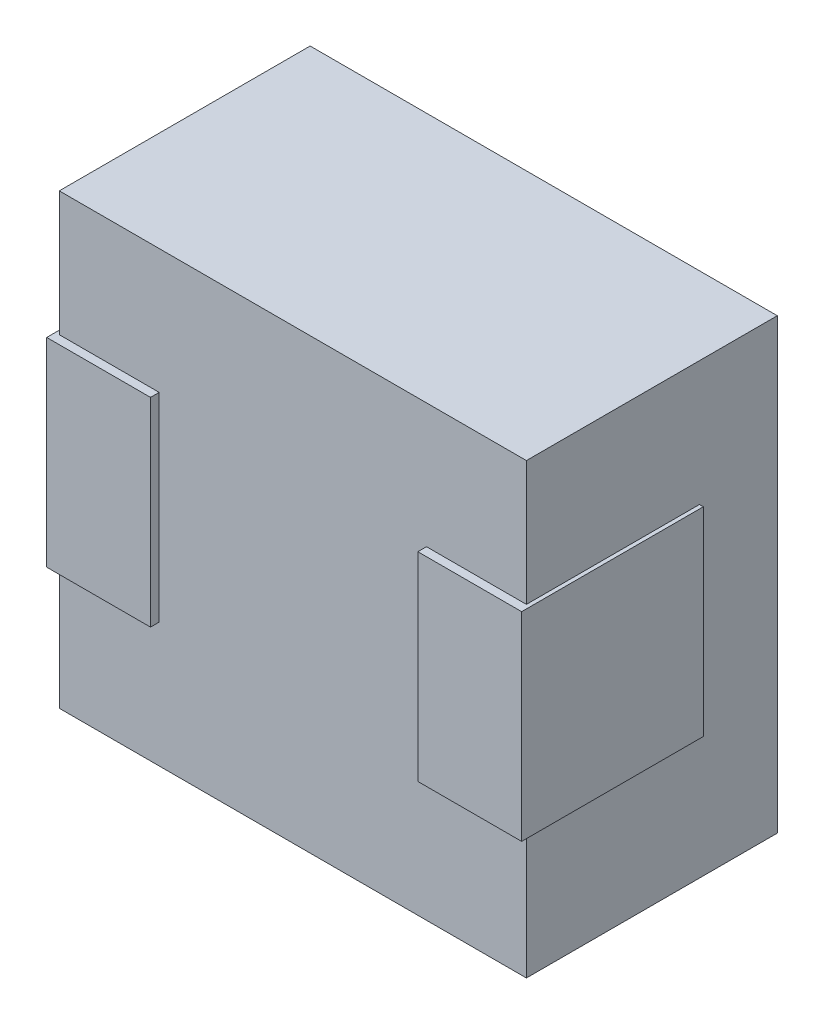
ISO-10303-21;
HEADER;
FILE_DESCRIPTION(('STEP AP214'),'2;1');
FILE_NAME('part.step','',(''),(''),'','','');
FILE_SCHEMA(('AUTOMOTIVE_DESIGN { 1 0 10303 214 1 1 1 1 }'));
ENDSEC;
DATA;
#1=APPLICATION_CONTEXT('core data for automotive mechanical design processes');
#2=APPLICATION_PROTOCOL_DEFINITION('international standard','automotive_design',2000,#1);
#3=PRODUCT_CONTEXT('',#1,'mechanical');
#4=PRODUCT('Part','Part','',(#3));
#5=PRODUCT_RELATED_PRODUCT_CATEGORY('part','',(#4));
#6=PRODUCT_DEFINITION_FORMATION('','',#4);
#7=PRODUCT_DEFINITION_CONTEXT('part definition',#1,'design');
#8=PRODUCT_DEFINITION('design','',#6,#7);
#9=PRODUCT_DEFINITION_SHAPE('','',#8);
#10=(LENGTH_UNIT() NAMED_UNIT(*) SI_UNIT(.MILLI.,.METRE.));
#11=(NAMED_UNIT(*) PLANE_ANGLE_UNIT() SI_UNIT($,.RADIAN.));
#12=(NAMED_UNIT(*) SI_UNIT($,.STERADIAN.) SOLID_ANGLE_UNIT());
#13=UNCERTAINTY_MEASURE_WITH_UNIT(LENGTH_MEASURE(1.E-05),#10,'distance_accuracy_value','');
#14=(GEOMETRIC_REPRESENTATION_CONTEXT(3) GLOBAL_UNCERTAINTY_ASSIGNED_CONTEXT((#13)) GLOBAL_UNIT_ASSIGNED_CONTEXT((#10,
#11,#12)) REPRESENTATION_CONTEXT('',''));
#15=CARTESIAN_POINT('',(0.,0.,0.));
#16=DIRECTION('',(0.,0.,1.));
#17=DIRECTION('',(1.,0.,0.));
#18=AXIS2_PLACEMENT_3D('',#15,#16,#17);
#19=CARTESIAN_POINT('',(0.,0.,3.));
#20=DIRECTION('',(0.,0.,1.));
#21=DIRECTION('',(1.,0.,0.));
#22=AXIS2_PLACEMENT_3D('',#19,#20,#21);
#23=PLANE('',#22);
#24=DIRECTION('',(1.,0.,0.));
#25=VECTOR('',#24,1.);
#26=CARTESIAN_POINT('',(0.,1.15,3.));
#27=LINE('',#26,#25);
#28=CARTESIAN_POINT('',(2.745,1.15,3.));
#29=VERTEX_POINT('',#28);
#30=CARTESIAN_POINT('',(1.545,1.15,3.));
#31=VERTEX_POINT('',#30);
#32=EDGE_CURVE('E165',#29,#31,#27,.F.);
#33=ORIENTED_EDGE('',*,*,#32,.T.);
#34=DIRECTION('',(0.,1.,0.));
#35=VECTOR('',#34,1.);
#36=CARTESIAN_POINT('',(1.545,1.15,3.));
#37=LINE('',#36,#35);
#38=CARTESIAN_POINT('',(1.545,-1.15,3.));
#39=VERTEX_POINT('',#38);
#40=EDGE_CURVE('E157',#31,#39,#37,.F.);
#41=ORIENTED_EDGE('',*,*,#40,.T.);
#42=DIRECTION('',(1.,0.,0.));
#43=VECTOR('',#42,1.);
#44=CARTESIAN_POINT('',(0.,-1.15,3.));
#45=LINE('',#44,#43);
#46=CARTESIAN_POINT('',(2.745,-1.15,3.));
#47=VERTEX_POINT('',#46);
#48=EDGE_CURVE('E20',#39,#47,#45,.T.);
#49=ORIENTED_EDGE('',*,*,#48,.T.);
#50=DIRECTION('',(0.,1.,0.));
#51=VECTOR('',#50,1.);
#52=CARTESIAN_POINT('',(2.745,1.15,3.));
#53=LINE('',#52,#51);
#54=EDGE_CURVE('E147',#47,#29,#53,.T.);
#55=ORIENTED_EDGE('',*,*,#54,.T.);
#56=EDGE_LOOP('',(#33,#41,#49,#55));
#57=FACE_BOUND('',#56,.T.);
#58=ADVANCED_FACE('F17',(#57),#23,.T.);
#59=CARTESIAN_POINT('',(0.,0.,3.));
#60=DIRECTION('',(0.,0.,1.));
#61=DIRECTION('',(1.,0.,0.));
#62=AXIS2_PLACEMENT_3D('',#59,#60,#61);
#63=PLANE('',#62);
#64=DIRECTION('',(0.,1.,0.));
#65=VECTOR('',#64,1.);
#66=CARTESIAN_POINT('',(-2.745,1.15,3.));
#67=LINE('',#66,#65);
#68=CARTESIAN_POINT('',(-2.745,1.15,3.));
#69=VERTEX_POINT('',#68);
#70=CARTESIAN_POINT('',(-2.745,-1.15,3.));
#71=VERTEX_POINT('',#70);
#72=EDGE_CURVE('E140',#69,#71,#67,.F.);
#73=ORIENTED_EDGE('',*,*,#72,.T.);
#74=DIRECTION('',(1.,0.,0.));
#75=VECTOR('',#74,1.);
#76=CARTESIAN_POINT('',(0.,-1.15,3.));
#77=LINE('',#76,#75);
#78=CARTESIAN_POINT('',(-1.545,-1.15,3.));
#79=VERTEX_POINT('',#78);
#80=EDGE_CURVE('E128',#71,#79,#77,.T.);
#81=ORIENTED_EDGE('',*,*,#80,.T.);
#82=DIRECTION('',(0.,1.,0.));
#83=VECTOR('',#82,1.);
#84=CARTESIAN_POINT('',(-1.545,1.15,3.));
#85=LINE('',#84,#83);
#86=CARTESIAN_POINT('',(-1.545,1.15,3.));
#87=VERTEX_POINT('',#86);
#88=EDGE_CURVE('E153',#79,#87,#85,.T.);
#89=ORIENTED_EDGE('',*,*,#88,.T.);
#90=DIRECTION('',(1.,0.,0.));
#91=VECTOR('',#90,1.);
#92=CARTESIAN_POINT('',(0.,1.15,3.));
#93=LINE('',#92,#91);
#94=EDGE_CURVE('E141',#87,#69,#93,.F.);
#95=ORIENTED_EDGE('',*,*,#94,.T.);
#96=EDGE_LOOP('',(#73,#81,#89,#95));
#97=FACE_BOUND('',#96,.T.);
#98=ADVANCED_FACE('F144',(#97),#63,.T.);
#99=CARTESIAN_POINT('',(-2.745,1.15,3.));
#100=DIRECTION('',(1.,0.,0.));
#101=DIRECTION('',(0.,0.,-1.));
#102=AXIS2_PLACEMENT_3D('',#99,#100,#101);
#103=PLANE('',#102);
#104=DIRECTION('',(0.,0.,1.));
#105=VECTOR('',#104,1.);
#106=CARTESIAN_POINT('',(-2.745,-1.15,3.));
#107=LINE('',#106,#105);
#108=CARTESIAN_POINT('',(-2.745,-1.15,0.9));
#109=VERTEX_POINT('',#108);
#110=EDGE_CURVE('E136',#109,#71,#107,.T.);
#111=ORIENTED_EDGE('',*,*,#110,.T.);
#112=ORIENTED_EDGE('',*,*,#72,.F.);
#113=DIRECTION('',(0.,0.,-1.));
#114=VECTOR('',#113,1.);
#115=CARTESIAN_POINT('',(-2.745,1.15,3.));
#116=LINE('',#115,#114);
#117=CARTESIAN_POINT('',(-2.745,1.15,0.9));
#118=VERTEX_POINT('',#117);
#119=EDGE_CURVE('E200',#69,#118,#116,.T.);
#120=ORIENTED_EDGE('',*,*,#119,.T.);
#121=DIRECTION('',(0.,1.,0.));
#122=VECTOR('',#121,1.);
#123=CARTESIAN_POINT('',(-2.745,0.,0.9));
#124=LINE('',#123,#122);
#125=EDGE_CURVE('E152',#118,#109,#124,.F.);
#126=ORIENTED_EDGE('',*,*,#125,.T.);
#127=EDGE_LOOP('',(#111,#112,#120,#126));
#128=FACE_BOUND('',#127,.T.);
#129=ADVANCED_FACE('F150',(#128),#103,.F.);
#130=CARTESIAN_POINT('',(2.745,1.15,3.));
#131=DIRECTION('',(-1.,0.,0.));
#132=DIRECTION('',(0.,0.,1.));
#133=AXIS2_PLACEMENT_3D('',#130,#131,#132);
#134=PLANE('',#133);
#135=DIRECTION('',(0.,0.,-1.));
#136=VECTOR('',#135,1.);
#137=CARTESIAN_POINT('',(2.745,1.15,3.));
#138=LINE('',#137,#136);
#139=CARTESIAN_POINT('',(2.745,1.15,0.9));
#140=VERTEX_POINT('',#139);
#141=EDGE_CURVE('E178',#140,#29,#138,.F.);
#142=ORIENTED_EDGE('',*,*,#141,.T.);
#143=ORIENTED_EDGE('',*,*,#54,.F.);
#144=DIRECTION('',(0.,0.,1.));
#145=VECTOR('',#144,1.);
#146=CARTESIAN_POINT('',(2.745,-1.15,3.));
#147=LINE('',#146,#145);
#148=CARTESIAN_POINT('',(2.745,-1.15,0.9));
#149=VERTEX_POINT('',#148);
#150=EDGE_CURVE('E176',#47,#149,#147,.F.);
#151=ORIENTED_EDGE('',*,*,#150,.T.);
#152=DIRECTION('',(0.,1.,0.));
#153=VECTOR('',#152,1.);
#154=CARTESIAN_POINT('',(2.745,0.,0.9));
#155=LINE('',#154,#153);
#156=EDGE_CURVE('E185',#149,#140,#155,.T.);
#157=ORIENTED_EDGE('',*,*,#156,.T.);
#158=EDGE_LOOP('',(#142,#143,#151,#157));
#159=FACE_BOUND('',#158,.T.);
#160=ADVANCED_FACE('F174',(#159),#134,.F.);
#161=CARTESIAN_POINT('',(1.545,1.15,3.));
#162=DIRECTION('',(1.,0.,0.));
#163=DIRECTION('',(0.,0.,-1.));
#164=AXIS2_PLACEMENT_3D('',#161,#162,#163);
#165=PLANE('',#164);
#166=ORIENTED_EDGE('',*,*,#40,.F.);
#167=DIRECTION('',(0.,0.,-1.));
#168=VECTOR('',#167,1.);
#169=CARTESIAN_POINT('',(1.545,1.15,3.));
#170=LINE('',#169,#168);
#171=CARTESIAN_POINT('',(1.545,1.15,2.9));
#172=VERTEX_POINT('',#171);
#173=EDGE_CURVE('E187',#31,#172,#170,.T.);
#174=ORIENTED_EDGE('',*,*,#173,.T.);
#175=DIRECTION('',(0.,1.,0.));
#176=VECTOR('',#175,1.);
#177=CARTESIAN_POINT('',(1.545,0.,2.9));
#178=LINE('',#177,#176);
#179=CARTESIAN_POINT('',(1.545,-1.15,2.9));
#180=VERTEX_POINT('',#179);
#181=EDGE_CURVE('E221',#180,#172,#178,.T.);
#182=ORIENTED_EDGE('',*,*,#181,.F.);
#183=DIRECTION('',(0.,0.,1.));
#184=VECTOR('',#183,1.);
#185=CARTESIAN_POINT('',(1.545,-1.15,3.));
#186=LINE('',#185,#184);
#187=EDGE_CURVE('E183',#180,#39,#186,.T.);
#188=ORIENTED_EDGE('',*,*,#187,.T.);
#189=EDGE_LOOP('',(#166,#174,#182,#188));
#190=FACE_BOUND('',#189,.T.);
#191=ADVANCED_FACE('F245',(#190),#165,.F.);
#192=CARTESIAN_POINT('',(-1.545,1.15,3.));
#193=DIRECTION('',(-1.,0.,0.));
#194=DIRECTION('',(0.,0.,1.));
#195=AXIS2_PLACEMENT_3D('',#192,#193,#194);
#196=PLANE('',#195);
#197=ORIENTED_EDGE('',*,*,#88,.F.);
#198=DIRECTION('',(0.,0.,1.));
#199=VECTOR('',#198,1.);
#200=CARTESIAN_POINT('',(-1.545,-1.15,3.));
#201=LINE('',#200,#199);
#202=CARTESIAN_POINT('',(-1.545,-1.15,2.9));
#203=VERTEX_POINT('',#202);
#204=EDGE_CURVE('E139',#79,#203,#201,.F.);
#205=ORIENTED_EDGE('',*,*,#204,.T.);
#206=DIRECTION('',(0.,1.,0.));
#207=VECTOR('',#206,1.);
#208=CARTESIAN_POINT('',(-1.545,0.,2.9));
#209=LINE('',#208,#207);
#210=CARTESIAN_POINT('',(-1.545,1.15,2.9));
#211=VERTEX_POINT('',#210);
#212=EDGE_CURVE('E205',#211,#203,#209,.F.);
#213=ORIENTED_EDGE('',*,*,#212,.F.);
#214=DIRECTION('',(0.,0.,-1.));
#215=VECTOR('',#214,1.);
#216=CARTESIAN_POINT('',(-1.545,1.15,3.));
#217=LINE('',#216,#215);
#218=EDGE_CURVE('E155',#211,#87,#217,.F.);
#219=ORIENTED_EDGE('',*,*,#218,.T.);
#220=EDGE_LOOP('',(#197,#205,#213,#219));
#221=FACE_BOUND('',#220,.T.);
#222=ADVANCED_FACE('F204',(#221),#196,.F.);
#223=CARTESIAN_POINT('',(-2.745,-1.15,3.));
#224=DIRECTION('',(0.,1.,0.));
#225=DIRECTION('',(0.,0.,1.));
#226=AXIS2_PLACEMENT_3D('',#223,#224,#225);
#227=PLANE('',#226);
#228=DIRECTION('',(1.,0.,0.));
#229=VECTOR('',#228,1.);
#230=CARTESIAN_POINT('',(0.,-1.15,2.9));
#231=LINE('',#230,#229);
#232=CARTESIAN_POINT('',(-2.7,-1.15,2.9));
#233=VERTEX_POINT('',#232);
#234=EDGE_CURVE('E219',#203,#233,#231,.F.);
#235=ORIENTED_EDGE('',*,*,#234,.F.);
#236=ORIENTED_EDGE('',*,*,#204,.F.);
#237=ORIENTED_EDGE('',*,*,#80,.F.);
#238=ORIENTED_EDGE('',*,*,#110,.F.);
#239=DIRECTION('',(1.,0.,0.));
#240=VECTOR('',#239,1.);
#241=CARTESIAN_POINT('',(0.,-1.15,0.9));
#242=LINE('',#241,#240);
#243=CARTESIAN_POINT('',(-2.7,-1.15,0.9));
#244=VERTEX_POINT('',#243);
#245=EDGE_CURVE('E194',#109,#244,#242,.T.);
#246=ORIENTED_EDGE('',*,*,#245,.T.);
#247=DIRECTION('',(0.,0.,-1.));
#248=VECTOR('',#247,1.);
#249=CARTESIAN_POINT('',(-2.7,-1.15,2.9));
#250=LINE('',#249,#248);
#251=EDGE_CURVE('E276',#244,#233,#250,.F.);
#252=ORIENTED_EDGE('',*,*,#251,.T.);
#253=EDGE_LOOP('',(#235,#236,#237,#238,#246,#252));
#254=FACE_BOUND('',#253,.T.);
#255=ADVANCED_FACE('F133',(#254),#227,.F.);
#256=CARTESIAN_POINT('',(-2.745,1.15,3.));
#257=DIRECTION('',(0.,-1.,0.));
#258=DIRECTION('',(0.,0.,-1.));
#259=AXIS2_PLACEMENT_3D('',#256,#257,#258);
#260=PLANE('',#259);
#261=DIRECTION('',(1.,0.,0.));
#262=VECTOR('',#261,1.);
#263=CARTESIAN_POINT('',(0.,1.15,0.9));
#264=LINE('',#263,#262);
#265=CARTESIAN_POINT('',(-2.7,1.15,0.9));
#266=VERTEX_POINT('',#265);
#267=EDGE_CURVE('E197',#266,#118,#264,.F.);
#268=ORIENTED_EDGE('',*,*,#267,.T.);
#269=ORIENTED_EDGE('',*,*,#119,.F.);
#270=ORIENTED_EDGE('',*,*,#94,.F.);
#271=ORIENTED_EDGE('',*,*,#218,.F.);
#272=DIRECTION('',(1.,0.,0.));
#273=VECTOR('',#272,1.);
#274=CARTESIAN_POINT('',(0.,1.15,2.9));
#275=LINE('',#274,#273);
#276=CARTESIAN_POINT('',(-2.7,1.15,2.9));
#277=VERTEX_POINT('',#276);
#278=EDGE_CURVE('E210',#277,#211,#275,.T.);
#279=ORIENTED_EDGE('',*,*,#278,.F.);
#280=DIRECTION('',(0.,0.,-1.));
#281=VECTOR('',#280,1.);
#282=CARTESIAN_POINT('',(-2.7,1.15,2.9));
#283=LINE('',#282,#281);
#284=EDGE_CURVE('E271',#277,#266,#283,.T.);
#285=ORIENTED_EDGE('',*,*,#284,.T.);
#286=EDGE_LOOP('',(#268,#269,#270,#271,#279,#285));
#287=FACE_BOUND('',#286,.T.);
#288=ADVANCED_FACE('F208',(#287),#260,.F.);
#289=CARTESIAN_POINT('',(0.,0.,0.9));
#290=DIRECTION('',(0.,0.,1.));
#291=DIRECTION('',(1.,0.,0.));
#292=AXIS2_PLACEMENT_3D('',#289,#290,#291);
#293=PLANE('',#292);
#294=ORIENTED_EDGE('',*,*,#245,.F.);
#295=ORIENTED_EDGE('',*,*,#125,.F.);
#296=ORIENTED_EDGE('',*,*,#267,.F.);
#297=DIRECTION('',(0.,1.,0.));
#298=VECTOR('',#297,1.);
#299=CARTESIAN_POINT('',(-2.7,2.59,0.9));
#300=LINE('',#299,#298);
#301=EDGE_CURVE('E268',#266,#244,#300,.F.);
#302=ORIENTED_EDGE('',*,*,#301,.T.);
#303=EDGE_LOOP('',(#294,#295,#296,#302));
#304=FACE_BOUND('',#303,.T.);
#305=ADVANCED_FACE('F284',(#304),#293,.F.);
#306=CARTESIAN_POINT('',(2.745,1.15,3.));
#307=DIRECTION('',(0.,-1.,0.));
#308=DIRECTION('',(0.,0.,-1.));
#309=AXIS2_PLACEMENT_3D('',#306,#307,#308);
#310=PLANE('',#309);
#311=ORIENTED_EDGE('',*,*,#32,.F.);
#312=ORIENTED_EDGE('',*,*,#141,.F.);
#313=DIRECTION('',(1.,0.,0.));
#314=VECTOR('',#313,1.);
#315=CARTESIAN_POINT('',(0.,1.15,0.9));
#316=LINE('',#315,#314);
#317=CARTESIAN_POINT('',(2.7,1.15,0.9));
#318=VERTEX_POINT('',#317);
#319=EDGE_CURVE('E229',#140,#318,#316,.F.);
#320=ORIENTED_EDGE('',*,*,#319,.T.);
#321=DIRECTION('',(0.,0.,1.));
#322=VECTOR('',#321,1.);
#323=CARTESIAN_POINT('',(2.7,1.15,2.9));
#324=LINE('',#323,#322);
#325=CARTESIAN_POINT('',(2.7,1.15,2.9));
#326=VERTEX_POINT('',#325);
#327=EDGE_CURVE('E241',#318,#326,#324,.T.);
#328=ORIENTED_EDGE('',*,*,#327,.T.);
#329=DIRECTION('',(1.,0.,0.));
#330=VECTOR('',#329,1.);
#331=CARTESIAN_POINT('',(0.,1.15,2.9));
#332=LINE('',#331,#330);
#333=EDGE_CURVE('E217',#172,#326,#332,.T.);
#334=ORIENTED_EDGE('',*,*,#333,.F.);
#335=ORIENTED_EDGE('',*,*,#173,.F.);
#336=EDGE_LOOP('',(#311,#312,#320,#328,#334,#335));
#337=FACE_BOUND('',#336,.T.);
#338=ADVANCED_FACE('F239',(#337),#310,.F.);
#339=CARTESIAN_POINT('',(2.745,-1.15,3.));
#340=DIRECTION('',(0.,1.,0.));
#341=DIRECTION('',(0.,0.,1.));
#342=AXIS2_PLACEMENT_3D('',#339,#340,#341);
#343=PLANE('',#342);
#344=DIRECTION('',(1.,0.,0.));
#345=VECTOR('',#344,1.);
#346=CARTESIAN_POINT('',(0.,-1.15,0.9));
#347=LINE('',#346,#345);
#348=CARTESIAN_POINT('',(2.7,-1.15,0.9));
#349=VERTEX_POINT('',#348);
#350=EDGE_CURVE('E182',#349,#149,#347,.T.);
#351=ORIENTED_EDGE('',*,*,#350,.T.);
#352=ORIENTED_EDGE('',*,*,#150,.F.);
#353=ORIENTED_EDGE('',*,*,#48,.F.);
#354=ORIENTED_EDGE('',*,*,#187,.F.);
#355=DIRECTION('',(1.,0.,0.));
#356=VECTOR('',#355,1.);
#357=CARTESIAN_POINT('',(0.,-1.15,2.9));
#358=LINE('',#357,#356);
#359=CARTESIAN_POINT('',(2.7,-1.15,2.9));
#360=VERTEX_POINT('',#359);
#361=EDGE_CURVE('E226',#360,#180,#358,.F.);
#362=ORIENTED_EDGE('',*,*,#361,.F.);
#363=DIRECTION('',(0.,0.,1.));
#364=VECTOR('',#363,1.);
#365=CARTESIAN_POINT('',(2.7,-1.15,2.9));
#366=LINE('',#365,#364);
#367=EDGE_CURVE('E254',#360,#349,#366,.F.);
#368=ORIENTED_EDGE('',*,*,#367,.T.);
#369=EDGE_LOOP('',(#351,#352,#353,#354,#362,#368));
#370=FACE_BOUND('',#369,.T.);
#371=ADVANCED_FACE('F180',(#370),#343,.F.);
#372=CARTESIAN_POINT('',(0.,0.,0.9));
#373=DIRECTION('',(0.,0.,1.));
#374=DIRECTION('',(1.,0.,0.));
#375=AXIS2_PLACEMENT_3D('',#372,#373,#374);
#376=PLANE('',#375);
#377=ORIENTED_EDGE('',*,*,#319,.F.);
#378=ORIENTED_EDGE('',*,*,#156,.F.);
#379=ORIENTED_EDGE('',*,*,#350,.F.);
#380=DIRECTION('',(0.,1.,0.));
#381=VECTOR('',#380,1.);
#382=CARTESIAN_POINT('',(2.7,2.59,0.9));
#383=LINE('',#382,#381);
#384=EDGE_CURVE('E236',#349,#318,#383,.T.);
#385=ORIENTED_EDGE('',*,*,#384,.T.);
#386=EDGE_LOOP('',(#377,#378,#379,#385));
#387=FACE_BOUND('',#386,.T.);
#388=ADVANCED_FACE('F233',(#387),#376,.F.);
#389=CARTESIAN_POINT('',(0.,0.,2.9));
#390=DIRECTION('',(0.,0.,1.));
#391=DIRECTION('',(1.,0.,0.));
#392=AXIS2_PLACEMENT_3D('',#389,#390,#391);
#393=PLANE('',#392);
#394=DIRECTION('',(0.,1.,0.));
#395=VECTOR('',#394,1.);
#396=CARTESIAN_POINT('',(-2.7,2.59,2.9));
#397=LINE('',#396,#395);
#398=CARTESIAN_POINT('',(-2.7,-2.59,2.9));
#399=VERTEX_POINT('',#398);
#400=EDGE_CURVE('E274',#233,#399,#397,.F.);
#401=ORIENTED_EDGE('',*,*,#400,.T.);
#402=DIRECTION('',(1.,0.,0.));
#403=VECTOR('',#402,1.);
#404=CARTESIAN_POINT('',(-2.7,-2.59,2.9));
#405=LINE('',#404,#403);
#406=CARTESIAN_POINT('',(2.7,-2.59,2.9));
#407=VERTEX_POINT('',#406);
#408=EDGE_CURVE('E251',#399,#407,#405,.T.);
#409=ORIENTED_EDGE('',*,*,#408,.T.);
#410=DIRECTION('',(0.,1.,0.));
#411=VECTOR('',#410,1.);
#412=CARTESIAN_POINT('',(2.7,2.59,2.9));
#413=LINE('',#412,#411);
#414=EDGE_CURVE('E249',#407,#360,#413,.T.);
#415=ORIENTED_EDGE('',*,*,#414,.T.);
#416=ORIENTED_EDGE('',*,*,#361,.T.);
#417=ORIENTED_EDGE('',*,*,#181,.T.);
#418=ORIENTED_EDGE('',*,*,#333,.T.);
#419=DIRECTION('',(0.,1.,0.));
#420=VECTOR('',#419,1.);
#421=CARTESIAN_POINT('',(2.7,2.59,2.9));
#422=LINE('',#421,#420);
#423=CARTESIAN_POINT('',(2.7,2.59,2.9));
#424=VERTEX_POINT('',#423);
#425=EDGE_CURVE('E258',#326,#424,#422,.T.);
#426=ORIENTED_EDGE('',*,*,#425,.T.);
#427=DIRECTION('',(1.,0.,0.));
#428=VECTOR('',#427,1.);
#429=CARTESIAN_POINT('',(-2.7,2.59,2.9));
#430=LINE('',#429,#428);
#431=CARTESIAN_POINT('',(-2.7,2.59,2.9));
#432=VERTEX_POINT('',#431);
#433=EDGE_CURVE('E289',#424,#432,#430,.F.);
#434=ORIENTED_EDGE('',*,*,#433,.T.);
#435=DIRECTION('',(0.,1.,0.));
#436=VECTOR('',#435,1.);
#437=CARTESIAN_POINT('',(-2.7,2.59,2.9));
#438=LINE('',#437,#436);
#439=EDGE_CURVE('E216',#432,#277,#438,.F.);
#440=ORIENTED_EDGE('',*,*,#439,.T.);
#441=ORIENTED_EDGE('',*,*,#278,.T.);
#442=ORIENTED_EDGE('',*,*,#212,.T.);
#443=ORIENTED_EDGE('',*,*,#234,.T.);
#444=EDGE_LOOP('',(#401,#409,#415,#416,#417,#418,#426,#434,#440,#441,#442,#443));
#445=FACE_BOUND('',#444,.T.);
#446=ADVANCED_FACE('F214',(#445),#393,.T.);
#447=CARTESIAN_POINT('',(-2.7,2.59,2.9));
#448=DIRECTION('',(1.,0.,0.));
#449=DIRECTION('',(0.,0.,-1.));
#450=AXIS2_PLACEMENT_3D('',#447,#448,#449);
#451=PLANE('',#450);
#452=ORIENTED_EDGE('',*,*,#284,.F.);
#453=ORIENTED_EDGE('',*,*,#439,.F.);
#454=DIRECTION('',(0.,0.,-1.));
#455=VECTOR('',#454,1.);
#456=CARTESIAN_POINT('',(-2.7,2.59,2.9));
#457=LINE('',#456,#455);
#458=CARTESIAN_POINT('',(-2.7,2.59,0.));
#459=VERTEX_POINT('',#458);
#460=EDGE_CURVE('E287',#432,#459,#457,.T.);
#461=ORIENTED_EDGE('',*,*,#460,.T.);
#462=DIRECTION('',(0.,1.,0.));
#463=VECTOR('',#462,1.);
#464=CARTESIAN_POINT('',(-2.7,0.,0.));
#465=LINE('',#464,#463);
#466=CARTESIAN_POINT('',(-2.7,-2.59,0.));
#467=VERTEX_POINT('',#466);
#468=EDGE_CURVE('E290',#459,#467,#465,.F.);
#469=ORIENTED_EDGE('',*,*,#468,.T.);
#470=DIRECTION('',(0.,0.,1.));
#471=VECTOR('',#470,1.);
#472=CARTESIAN_POINT('',(-2.7,-2.59,2.9));
#473=LINE('',#472,#471);
#474=EDGE_CURVE('E265',#467,#399,#473,.T.);
#475=ORIENTED_EDGE('',*,*,#474,.T.);
#476=ORIENTED_EDGE('',*,*,#400,.F.);
#477=ORIENTED_EDGE('',*,*,#251,.F.);
#478=ORIENTED_EDGE('',*,*,#301,.F.);
#479=EDGE_LOOP('',(#452,#453,#461,#469,#475,#476,#477,#478));
#480=FACE_BOUND('',#479,.T.);
#481=ADVANCED_FACE('F280',(#480),#451,.F.);
#482=CARTESIAN_POINT('',(-2.7,-2.59,2.9));
#483=DIRECTION('',(0.,1.,0.));
#484=DIRECTION('',(0.,0.,1.));
#485=AXIS2_PLACEMENT_3D('',#482,#483,#484);
#486=PLANE('',#485);
#487=ORIENTED_EDGE('',*,*,#408,.F.);
#488=ORIENTED_EDGE('',*,*,#474,.F.);
#489=DIRECTION('',(1.,0.,0.));
#490=VECTOR('',#489,1.);
#491=CARTESIAN_POINT('',(0.,-2.59,0.));
#492=LINE('',#491,#490);
#493=CARTESIAN_POINT('',(2.7,-2.59,0.));
#494=VERTEX_POINT('',#493);
#495=EDGE_CURVE('E297',#467,#494,#492,.T.);
#496=ORIENTED_EDGE('',*,*,#495,.T.);
#497=DIRECTION('',(0.,0.,1.));
#498=VECTOR('',#497,1.);
#499=CARTESIAN_POINT('',(2.7,-2.59,2.9));
#500=LINE('',#499,#498);
#501=EDGE_CURVE('E255',#494,#407,#500,.T.);
#502=ORIENTED_EDGE('',*,*,#501,.T.);
#503=EDGE_LOOP('',(#487,#488,#496,#502));
#504=FACE_BOUND('',#503,.T.);
#505=ADVANCED_FACE('F307',(#504),#486,.F.);
#506=CARTESIAN_POINT('',(2.7,2.59,2.9));
#507=DIRECTION('',(-1.,0.,0.));
#508=DIRECTION('',(0.,0.,1.));
#509=AXIS2_PLACEMENT_3D('',#506,#507,#508);
#510=PLANE('',#509);
#511=ORIENTED_EDGE('',*,*,#367,.F.);
#512=ORIENTED_EDGE('',*,*,#414,.F.);
#513=ORIENTED_EDGE('',*,*,#501,.F.);
#514=DIRECTION('',(0.,1.,0.));
#515=VECTOR('',#514,1.);
#516=CARTESIAN_POINT('',(2.7,0.,0.));
#517=LINE('',#516,#515);
#518=CARTESIAN_POINT('',(2.7,2.59,0.));
#519=VERTEX_POINT('',#518);
#520=EDGE_CURVE('E26',#494,#519,#517,.T.);
#521=ORIENTED_EDGE('',*,*,#520,.T.);
#522=DIRECTION('',(0.,0.,-1.));
#523=VECTOR('',#522,1.);
#524=CARTESIAN_POINT('',(2.7,2.59,2.9));
#525=LINE('',#524,#523);
#526=EDGE_CURVE('E34',#519,#424,#525,.F.);
#527=ORIENTED_EDGE('',*,*,#526,.T.);
#528=ORIENTED_EDGE('',*,*,#425,.F.);
#529=ORIENTED_EDGE('',*,*,#327,.F.);
#530=ORIENTED_EDGE('',*,*,#384,.F.);
#531=EDGE_LOOP('',(#511,#512,#513,#521,#527,#528,#529,#530));
#532=FACE_BOUND('',#531,.T.);
#533=ADVANCED_FACE('F302',(#532),#510,.F.);
#534=CARTESIAN_POINT('',(-2.7,2.59,2.9));
#535=DIRECTION('',(0.,-1.,0.));
#536=DIRECTION('',(0.,0.,-1.));
#537=AXIS2_PLACEMENT_3D('',#534,#535,#536);
#538=PLANE('',#537);
#539=ORIENTED_EDGE('',*,*,#433,.F.);
#540=ORIENTED_EDGE('',*,*,#526,.F.);
#541=DIRECTION('',(1.,0.,0.));
#542=VECTOR('',#541,1.);
#543=CARTESIAN_POINT('',(0.,2.59,0.));
#544=LINE('',#543,#542);
#545=EDGE_CURVE('E11',#519,#459,#544,.F.);
#546=ORIENTED_EDGE('',*,*,#545,.T.);
#547=ORIENTED_EDGE('',*,*,#460,.F.);
#548=EDGE_LOOP('',(#539,#540,#546,#547));
#549=FACE_BOUND('',#548,.T.);
#550=ADVANCED_FACE('F288',(#549),#538,.F.);
#551=CARTESIAN_POINT('',(0.,0.,0.));
#552=DIRECTION('',(0.,0.,1.));
#553=DIRECTION('',(1.,0.,0.));
#554=AXIS2_PLACEMENT_3D('',#551,#552,#553);
#555=PLANE('',#554);
#556=ORIENTED_EDGE('',*,*,#520,.F.);
#557=ORIENTED_EDGE('',*,*,#495,.F.);
#558=ORIENTED_EDGE('',*,*,#468,.F.);
#559=ORIENTED_EDGE('',*,*,#545,.F.);
#560=EDGE_LOOP('',(#556,#557,#558,#559));
#561=FACE_BOUND('',#560,.T.);
#562=ADVANCED_FACE('F305',(#561),#555,.F.);
#563=CLOSED_SHELL('',(#58,#98,#129,#160,#191,#222,#255,#288,#305,#338,#371,#388,#446,#481,#505,
#533,#550,#562));
#564=MANIFOLD_SOLID_BREP('B1',#563);
#565=ADVANCED_BREP_SHAPE_REPRESENTATION('',(#18,#564),#14);
#566=SHAPE_DEFINITION_REPRESENTATION(#9,#565);
ENDSEC;
END-ISO-10303-21;
